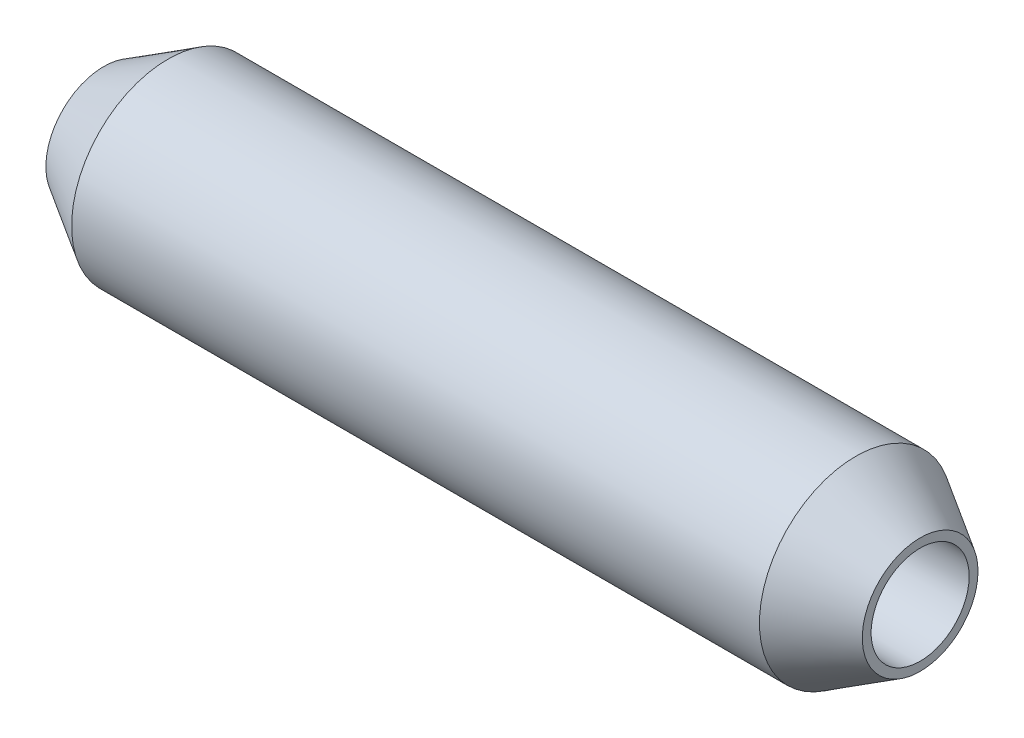
ISO-10303-21;
HEADER;
FILE_DESCRIPTION(('STEP AP214'),'2;1');
FILE_NAME('part.step','',(''),(''),'','','');
FILE_SCHEMA(('AUTOMOTIVE_DESIGN { 1 0 10303 214 1 1 1 1 }'));
ENDSEC;
DATA;
#1=APPLICATION_CONTEXT('core data for automotive mechanical design processes');
#2=APPLICATION_PROTOCOL_DEFINITION('international standard','automotive_design',2000,#1);
#3=PRODUCT_CONTEXT('',#1,'mechanical');
#4=PRODUCT('Part','Part','',(#3));
#5=PRODUCT_RELATED_PRODUCT_CATEGORY('part','',(#4));
#6=PRODUCT_DEFINITION_FORMATION('','',#4);
#7=PRODUCT_DEFINITION_CONTEXT('part definition',#1,'design');
#8=PRODUCT_DEFINITION('design','',#6,#7);
#9=PRODUCT_DEFINITION_SHAPE('','',#8);
#10=(LENGTH_UNIT() NAMED_UNIT(*) SI_UNIT(.MILLI.,.METRE.));
#11=(NAMED_UNIT(*) PLANE_ANGLE_UNIT() SI_UNIT($,.RADIAN.));
#12=(NAMED_UNIT(*) SI_UNIT($,.STERADIAN.) SOLID_ANGLE_UNIT());
#13=UNCERTAINTY_MEASURE_WITH_UNIT(LENGTH_MEASURE(1.E-05),#10,'distance_accuracy_value','');
#14=(GEOMETRIC_REPRESENTATION_CONTEXT(3) GLOBAL_UNCERTAINTY_ASSIGNED_CONTEXT((#13)) GLOBAL_UNIT_ASSIGNED_CONTEXT((#10,
#11,#12)) REPRESENTATION_CONTEXT('',''));
#15=CARTESIAN_POINT('',(0.,0.,0.));
#16=DIRECTION('',(0.,0.,1.));
#17=DIRECTION('',(1.,0.,0.));
#18=AXIS2_PLACEMENT_3D('',#15,#16,#17);
#19=CARTESIAN_POINT('',(25.4,0.,0.));
#20=DIRECTION('',(1.,0.,0.));
#21=DIRECTION('',(0.,0.,-1.));
#22=AXIS2_PLACEMENT_3D('',#19,#20,#21);
#23=PLANE('',#22);
#24=CARTESIAN_POINT('',(25.4,0.,0.));
#25=DIRECTION('',(1.,0.,0.));
#26=DIRECTION('',(0.,0.,-1.));
#27=AXIS2_PLACEMENT_3D('',#24,#25,#26);
#28=CIRCLE('',#27,1.79999999999999);
#29=CARTESIAN_POINT('',(25.4,0.,-1.79999999999999));
#30=VERTEX_POINT('',#29);
#31=EDGE_CURVE('E10',#30,#30,#28,.T.);
#32=ORIENTED_EDGE('',*,*,#31,.T.);
#33=EDGE_LOOP('',(#32));
#34=FACE_BOUND('',#33,.T.);
#35=CARTESIAN_POINT('',(25.4,0.,0.));
#36=DIRECTION('',(1.,0.,0.));
#37=DIRECTION('',(0.,0.,-1.));
#38=AXIS2_PLACEMENT_3D('',#35,#36,#37);
#39=CIRCLE('',#38,1.525);
#40=CARTESIAN_POINT('',(25.4,0.,-1.525));
#41=VERTEX_POINT('',#40);
#42=EDGE_CURVE('E50',#41,#41,#39,.T.);
#43=ORIENTED_EDGE('',*,*,#42,.F.);
#44=EDGE_LOOP('',(#43));
#45=FACE_BOUND('',#44,.T.);
#46=ADVANCED_FACE('F30',(#34,#45),#23,.T.);
#47=CARTESIAN_POINT('',(0.,0.,0.));
#48=DIRECTION('',(1.,0.,0.));
#49=DIRECTION('',(0.,0.,-1.));
#50=AXIS2_PLACEMENT_3D('',#47,#48,#49);
#51=PLANE('',#50);
#52=CARTESIAN_POINT('',(0.,0.,0.));
#53=DIRECTION('',(1.,0.,0.));
#54=DIRECTION('',(0.,0.,-1.));
#55=AXIS2_PLACEMENT_3D('',#52,#53,#54);
#56=CIRCLE('',#55,1.8);
#57=CARTESIAN_POINT('',(0.,0.,-1.8));
#58=VERTEX_POINT('',#57);
#59=EDGE_CURVE('E37',#58,#58,#56,.F.);
#60=ORIENTED_EDGE('',*,*,#59,.T.);
#61=EDGE_LOOP('',(#60));
#62=FACE_BOUND('',#61,.T.);
#63=CARTESIAN_POINT('',(0.,0.,0.));
#64=DIRECTION('',(1.,0.,0.));
#65=DIRECTION('',(0.,0.,-1.));
#66=AXIS2_PLACEMENT_3D('',#63,#64,#65);
#67=CIRCLE('',#66,1.525);
#68=CARTESIAN_POINT('',(0.,0.,-1.525));
#69=VERTEX_POINT('',#68);
#70=EDGE_CURVE('E51',#69,#69,#67,.T.);
#71=ORIENTED_EDGE('',*,*,#70,.T.);
#72=EDGE_LOOP('',(#71));
#73=FACE_BOUND('',#72,.T.);
#74=ADVANCED_FACE('F61',(#62,#73),#51,.F.);
#75=CARTESIAN_POINT('',(25.4,0.,0.));
#76=DIRECTION('',(-1.,0.,0.));
#77=DIRECTION('',(0.,0.,1.));
#78=AXIS2_PLACEMENT_3D('',#75,#76,#77);
#79=CYLINDRICAL_SURFACE('',#78,3.);
#80=CARTESIAN_POINT('',(2.,0.,0.));
#81=DIRECTION('',(1.,0.,0.));
#82=DIRECTION('',(0.,0.,-1.));
#83=AXIS2_PLACEMENT_3D('',#80,#81,#82);
#84=CIRCLE('',#83,3.);
#85=CARTESIAN_POINT('',(2.,0.,-3.));
#86=VERTEX_POINT('',#85);
#87=EDGE_CURVE('E41',#86,#86,#84,.T.);
#88=ORIENTED_EDGE('',*,*,#87,.T.);
#89=EDGE_LOOP('',(#88));
#90=FACE_BOUND('',#89,.T.);
#91=CARTESIAN_POINT('',(23.4,0.,0.));
#92=DIRECTION('',(1.,0.,0.));
#93=DIRECTION('',(0.,0.,-1.));
#94=AXIS2_PLACEMENT_3D('',#91,#92,#93);
#95=CIRCLE('',#94,3.);
#96=CARTESIAN_POINT('',(23.4,0.,-3.));
#97=VERTEX_POINT('',#96);
#98=EDGE_CURVE('E45',#97,#97,#95,.F.);
#99=ORIENTED_EDGE('',*,*,#98,.T.);
#100=EDGE_LOOP('',(#99));
#101=FACE_BOUND('',#100,.T.);
#102=ADVANCED_FACE('F66',(#90,#101),#79,.T.);
#103=CARTESIAN_POINT('',(25.4,0.,0.));
#104=DIRECTION('',(-1.,0.,0.));
#105=DIRECTION('',(0.,0.,1.));
#106=AXIS2_PLACEMENT_3D('',#103,#104,#105);
#107=CYLINDRICAL_SURFACE('',#106,1.525);
#108=ORIENTED_EDGE('',*,*,#42,.T.);
#109=EDGE_LOOP('',(#108));
#110=FACE_BOUND('',#109,.T.);
#111=ORIENTED_EDGE('',*,*,#70,.F.);
#112=EDGE_LOOP('',(#111));
#113=FACE_BOUND('',#112,.T.);
#114=ADVANCED_FACE('F57',(#110,#113),#107,.F.);
#115=CARTESIAN_POINT('',(2.,0.,0.));
#116=DIRECTION('',(1.,0.,0.));
#117=DIRECTION('',(0.,0.,-1.));
#118=AXIS2_PLACEMENT_3D('',#115,#116,#117);
#119=CONICAL_SURFACE('',#118,3.,0.540419500270584);
#120=ORIENTED_EDGE('',*,*,#59,.F.);
#121=EDGE_LOOP('',(#120));
#122=FACE_BOUND('',#121,.T.);
#123=ORIENTED_EDGE('',*,*,#87,.F.);
#124=EDGE_LOOP('',(#123));
#125=FACE_BOUND('',#124,.T.);
#126=ADVANCED_FACE('F72',(#122,#125),#119,.T.);
#127=CARTESIAN_POINT('',(25.4,0.,0.));
#128=DIRECTION('',(-1.,0.,0.));
#129=DIRECTION('',(0.,0.,1.));
#130=AXIS2_PLACEMENT_3D('',#127,#128,#129);
#131=CONICAL_SURFACE('',#130,1.79999999999999,0.540419500270581);
#132=ORIENTED_EDGE('',*,*,#98,.F.);
#133=EDGE_LOOP('',(#132));
#134=FACE_BOUND('',#133,.T.);
#135=ORIENTED_EDGE('',*,*,#31,.F.);
#136=EDGE_LOOP('',(#135));
#137=FACE_BOUND('',#136,.T.);
#138=ADVANCED_FACE('F32',(#134,#137),#131,.T.);
#139=CLOSED_SHELL('',(#46,#74,#102,#114,#126,#138));
#140=MANIFOLD_SOLID_BREP('B2',#139);
#141=ADVANCED_BREP_SHAPE_REPRESENTATION('',(#18,#140),#14);
#142=SHAPE_DEFINITION_REPRESENTATION(#9,#141);
ENDSEC;
END-ISO-10303-21;
